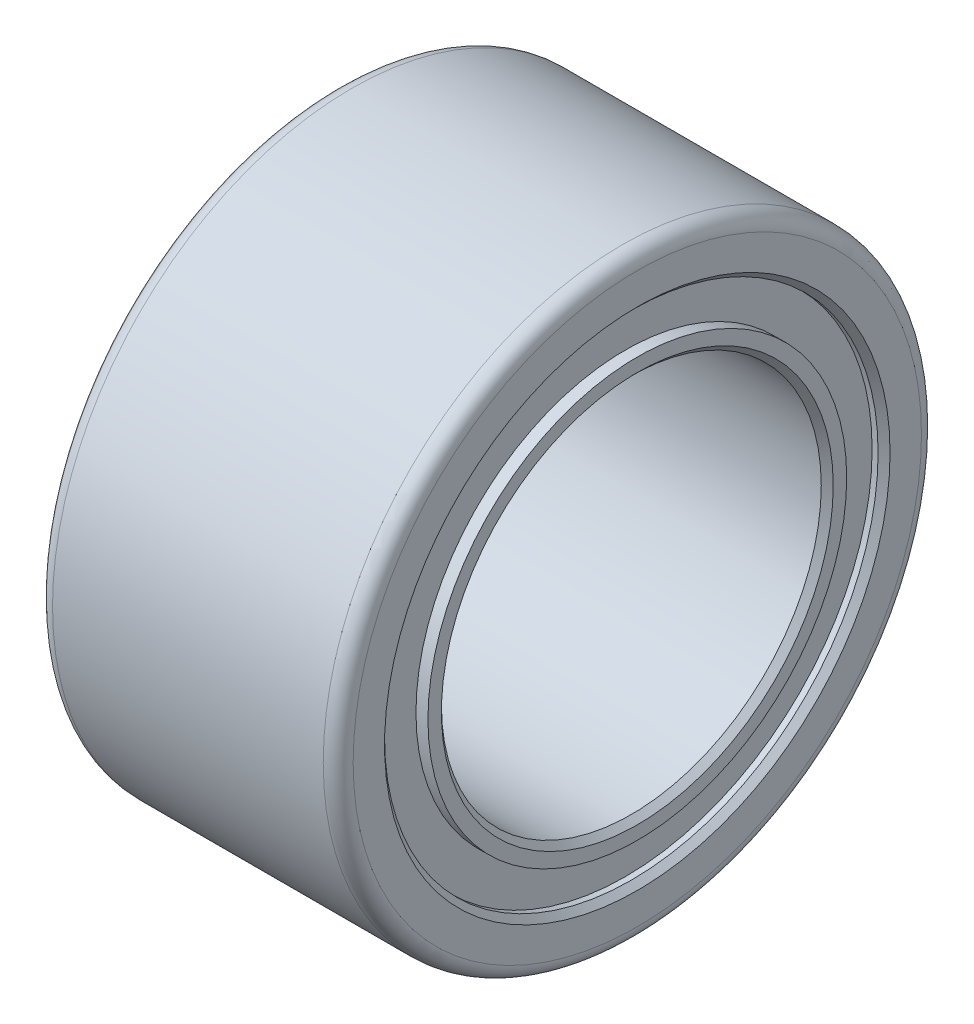
ISO-10303-21;
HEADER;
FILE_DESCRIPTION(('STEP AP214'),'2;1');
FILE_NAME('part.step','',(''),(''),'','','');
FILE_SCHEMA(('AUTOMOTIVE_DESIGN { 1 0 10303 214 1 1 1 1 }'));
ENDSEC;
DATA;
#1=APPLICATION_CONTEXT('core data for automotive mechanical design processes');
#2=APPLICATION_PROTOCOL_DEFINITION('international standard','automotive_design',2000,#1);
#3=PRODUCT_CONTEXT('',#1,'mechanical');
#4=PRODUCT('Part','Part','',(#3));
#5=PRODUCT_RELATED_PRODUCT_CATEGORY('part','',(#4));
#6=PRODUCT_DEFINITION_FORMATION('','',#4);
#7=PRODUCT_DEFINITION_CONTEXT('part definition',#1,'design');
#8=PRODUCT_DEFINITION('design','',#6,#7);
#9=PRODUCT_DEFINITION_SHAPE('','',#8);
#10=(LENGTH_UNIT() NAMED_UNIT(*) SI_UNIT(.MILLI.,.METRE.));
#11=(NAMED_UNIT(*) PLANE_ANGLE_UNIT() SI_UNIT($,.RADIAN.));
#12=(NAMED_UNIT(*) SI_UNIT($,.STERADIAN.) SOLID_ANGLE_UNIT());
#13=UNCERTAINTY_MEASURE_WITH_UNIT(LENGTH_MEASURE(1.E-05),#10,'distance_accuracy_value','');
#14=(GEOMETRIC_REPRESENTATION_CONTEXT(3) GLOBAL_UNCERTAINTY_ASSIGNED_CONTEXT((#13)) GLOBAL_UNIT_ASSIGNED_CONTEXT((#10,
#11,#12)) REPRESENTATION_CONTEXT('',''));
#15=CARTESIAN_POINT('',(0.,0.,0.));
#16=DIRECTION('',(0.,0.,1.));
#17=DIRECTION('',(1.,0.,0.));
#18=AXIS2_PLACEMENT_3D('',#15,#16,#17);
#19=CARTESIAN_POINT('',(-2.4892,0.,0.));
#20=DIRECTION('',(1.,0.,0.));
#21=DIRECTION('',(0.,0.,-1.));
#22=AXIS2_PLACEMENT_3D('',#19,#20,#21);
#23=PLANE('',#22);
#24=CARTESIAN_POINT('',(-2.4892,0.,0.));
#25=DIRECTION('',(1.,0.,0.));
#26=DIRECTION('',(0.,0.,-1.));
#27=AXIS2_PLACEMENT_3D('',#24,#25,#26);
#28=CIRCLE('',#27,4.9);
#29=CARTESIAN_POINT('',(-2.4892,0.,-4.9));
#30=VERTEX_POINT('',#29);
#31=EDGE_CURVE('E52',#30,#30,#28,.F.);
#32=ORIENTED_EDGE('',*,*,#31,.T.);
#33=EDGE_LOOP('',(#32));
#34=FACE_BOUND('',#33,.T.);
#35=CARTESIAN_POINT('',(-2.4892,0.,0.));
#36=DIRECTION('',(1.,0.,0.));
#37=DIRECTION('',(0.,0.,-1.));
#38=AXIS2_PLACEMENT_3D('',#35,#36,#37);
#39=CIRCLE('',#38,4.125);
#40=CARTESIAN_POINT('',(-2.4892,0.,-4.125));
#41=VERTEX_POINT('',#40);
#42=EDGE_CURVE('E83',#41,#41,#39,.T.);
#43=ORIENTED_EDGE('',*,*,#42,.T.);
#44=EDGE_LOOP('',(#43));
#45=FACE_BOUND('',#44,.T.);
#46=ADVANCED_FACE('F32',(#34,#45),#23,.F.);
#47=CARTESIAN_POINT('',(2.4892,0.,0.));
#48=DIRECTION('',(1.,0.,0.));
#49=DIRECTION('',(0.,0.,-1.));
#50=AXIS2_PLACEMENT_3D('',#47,#48,#49);
#51=PLANE('',#50);
#52=CARTESIAN_POINT('',(2.4892,0.,0.));
#53=DIRECTION('',(1.,0.,0.));
#54=DIRECTION('',(0.,0.,-1.));
#55=AXIS2_PLACEMENT_3D('',#52,#53,#54);
#56=CIRCLE('',#55,3.275);
#57=CARTESIAN_POINT('',(2.4892,0.,-3.275));
#58=VERTEX_POINT('',#57);
#59=EDGE_CURVE('E58',#58,#58,#56,.F.);
#60=ORIENTED_EDGE('',*,*,#59,.T.);
#61=EDGE_LOOP('',(#60));
#62=FACE_BOUND('',#61,.T.);
#63=CARTESIAN_POINT('',(2.4892,0.,0.));
#64=DIRECTION('',(1.,0.,0.));
#65=DIRECTION('',(0.,0.,-1.));
#66=AXIS2_PLACEMENT_3D('',#63,#64,#65);
#67=CIRCLE('',#66,3.5);
#68=CARTESIAN_POINT('',(2.4892,0.,-3.5));
#69=VERTEX_POINT('',#68);
#70=EDGE_CURVE('E77',#69,#69,#67,.T.);
#71=ORIENTED_EDGE('',*,*,#70,.T.);
#72=EDGE_LOOP('',(#71));
#73=FACE_BOUND('',#72,.T.);
#74=ADVANCED_FACE('F120',(#62,#73),#51,.T.);
#75=CARTESIAN_POINT('',(2.4892,0.,0.));
#76=DIRECTION('',(-1.,0.,0.));
#77=DIRECTION('',(0.,0.,1.));
#78=AXIS2_PLACEMENT_3D('',#75,#76,#77);
#79=CYLINDRICAL_SURFACE('',#78,5.);
#80=CARTESIAN_POINT('',(-2.28564660940672,0.,0.));
#81=DIRECTION('',(-1.,0.,0.));
#82=DIRECTION('',(0.,0.,1.));
#83=AXIS2_PLACEMENT_3D('',#80,#81,#82);
#84=CIRCLE('',#83,5.);
#85=CARTESIAN_POINT('',(-2.28564660940672,0.,5.));
#86=VERTEX_POINT('',#85);
#87=EDGE_CURVE('E43',#86,#86,#84,.F.);
#88=ORIENTED_EDGE('',*,*,#87,.T.);
#89=EDGE_LOOP('',(#88));
#90=FACE_BOUND('',#89,.T.);
#91=CARTESIAN_POINT('',(2.2392,0.,0.));
#92=DIRECTION('',(1.,0.,0.));
#93=DIRECTION('',(0.,0.,-1.));
#94=AXIS2_PLACEMENT_3D('',#91,#92,#93);
#95=CIRCLE('',#94,5.);
#96=CARTESIAN_POINT('',(2.2392,0.,-5.));
#97=VERTEX_POINT('',#96);
#98=EDGE_CURVE('E47',#97,#97,#95,.F.);
#99=ORIENTED_EDGE('',*,*,#98,.T.);
#100=EDGE_LOOP('',(#99));
#101=FACE_BOUND('',#100,.T.);
#102=ADVANCED_FACE('F118',(#90,#101),#79,.T.);
#103=CARTESIAN_POINT('',(2.4892,0.,0.));
#104=DIRECTION('',(1.,0.,0.));
#105=DIRECTION('',(0.,0.,-1.));
#106=AXIS2_PLACEMENT_3D('',#103,#104,#105);
#107=CIRCLE('',#106,4.75);
#108=CARTESIAN_POINT('',(2.4892,0.,-4.75));
#109=VERTEX_POINT('',#108);
#110=EDGE_CURVE('E10',#109,#109,#107,.T.);
#111=ORIENTED_EDGE('',*,*,#110,.T.);
#112=EDGE_LOOP('',(#111));
#113=FACE_BOUND('',#112,.T.);
#114=CARTESIAN_POINT('',(2.4892,0.,0.));
#115=DIRECTION('',(1.,0.,0.));
#116=DIRECTION('',(0.,0.,-1.));
#117=AXIS2_PLACEMENT_3D('',#114,#115,#116);
#118=CIRCLE('',#117,4.225);
#119=CARTESIAN_POINT('',(2.4892,0.,-4.225));
#120=VERTEX_POINT('',#119);
#121=EDGE_CURVE('E67',#120,#120,#118,.F.);
#122=ORIENTED_EDGE('',*,*,#121,.T.);
#123=EDGE_LOOP('',(#122));
#124=FACE_BOUND('',#123,.T.);
#125=ADVANCED_FACE('F108',(#113,#124),#51,.T.);
#126=CARTESIAN_POINT('',(-2.4892,0.,0.));
#127=DIRECTION('',(1.,0.,0.));
#128=DIRECTION('',(0.,0.,-1.));
#129=AXIS2_PLACEMENT_3D('',#126,#127,#128);
#130=CIRCLE('',#129,3.275);
#131=CARTESIAN_POINT('',(-2.4892,0.,-3.275));
#132=VERTEX_POINT('',#131);
#133=EDGE_CURVE('E55',#132,#132,#130,.T.);
#134=ORIENTED_EDGE('',*,*,#133,.T.);
#135=EDGE_LOOP('',(#134));
#136=FACE_BOUND('',#135,.T.);
#137=CARTESIAN_POINT('',(-2.4892,0.,0.));
#138=DIRECTION('',(1.,0.,0.));
#139=DIRECTION('',(0.,0.,-1.));
#140=AXIS2_PLACEMENT_3D('',#137,#138,#139);
#141=CIRCLE('',#140,3.5);
#142=CARTESIAN_POINT('',(-2.4892,0.,-3.5));
#143=VERTEX_POINT('',#142);
#144=EDGE_CURVE('E89',#143,#143,#141,.T.);
#145=ORIENTED_EDGE('',*,*,#144,.F.);
#146=EDGE_LOOP('',(#145));
#147=FACE_BOUND('',#146,.T.);
#148=ADVANCED_FACE('F105',(#136,#147),#23,.F.);
#149=CARTESIAN_POINT('',(-2.4892,0.,0.));
#150=DIRECTION('',(1.,0.,0.));
#151=DIRECTION('',(0.,0.,-1.));
#152=AXIS2_PLACEMENT_3D('',#149,#150,#151);
#153=CYLINDRICAL_SURFACE('',#152,3.175);
#154=CARTESIAN_POINT('',(2.3892,0.,0.));
#155=DIRECTION('',(1.,0.,0.));
#156=DIRECTION('',(0.,0.,-1.));
#157=AXIS2_PLACEMENT_3D('',#154,#155,#156);
#158=CIRCLE('',#157,3.175);
#159=CARTESIAN_POINT('',(2.3892,0.,-3.175));
#160=VERTEX_POINT('',#159);
#161=EDGE_CURVE('E61',#160,#160,#158,.T.);
#162=ORIENTED_EDGE('',*,*,#161,.T.);
#163=EDGE_LOOP('',(#162));
#164=FACE_BOUND('',#163,.T.);
#165=CARTESIAN_POINT('',(-2.3892,0.,0.));
#166=DIRECTION('',(1.,0.,0.));
#167=DIRECTION('',(0.,0.,-1.));
#168=AXIS2_PLACEMENT_3D('',#165,#166,#167);
#169=CIRCLE('',#168,3.175);
#170=CARTESIAN_POINT('',(-2.3892,0.,-3.175));
#171=VERTEX_POINT('',#170);
#172=EDGE_CURVE('E64',#171,#171,#169,.F.);
#173=ORIENTED_EDGE('',*,*,#172,.T.);
#174=EDGE_LOOP('',(#173));
#175=FACE_BOUND('',#174,.T.);
#176=ADVANCED_FACE('F107',(#164,#175),#153,.F.);
#177=CARTESIAN_POINT('',(2.2892,0.,0.));
#178=DIRECTION('',(1.,0.,0.));
#179=DIRECTION('',(0.,0.,-1.));
#180=AXIS2_PLACEMENT_3D('',#177,#178,#179);
#181=CYLINDRICAL_SURFACE('',#180,4.125);
#182=CARTESIAN_POINT('',(2.3892,0.,0.));
#183=DIRECTION('',(1.,0.,0.));
#184=DIRECTION('',(0.,0.,-1.));
#185=AXIS2_PLACEMENT_3D('',#182,#183,#184);
#186=CIRCLE('',#185,4.125);
#187=CARTESIAN_POINT('',(2.3892,0.,-4.125));
#188=VERTEX_POINT('',#187);
#189=EDGE_CURVE('E70',#188,#188,#186,.T.);
#190=ORIENTED_EDGE('',*,*,#189,.T.);
#191=EDGE_LOOP('',(#190));
#192=FACE_BOUND('',#191,.T.);
#193=CARTESIAN_POINT('',(2.2892,0.,0.));
#194=DIRECTION('',(1.,0.,0.));
#195=DIRECTION('',(0.,0.,-1.));
#196=AXIS2_PLACEMENT_3D('',#193,#194,#195);
#197=CIRCLE('',#196,4.125);
#198=CARTESIAN_POINT('',(2.2892,0.,-4.125));
#199=VERTEX_POINT('',#198);
#200=EDGE_CURVE('E73',#199,#199,#197,.T.);
#201=ORIENTED_EDGE('',*,*,#200,.F.);
#202=EDGE_LOOP('',(#201));
#203=FACE_BOUND('',#202,.T.);
#204=ADVANCED_FACE('F115',(#192,#203),#181,.F.);
#205=CARTESIAN_POINT('',(2.2892,0.,0.));
#206=DIRECTION('',(1.,0.,0.));
#207=DIRECTION('',(0.,0.,-1.));
#208=AXIS2_PLACEMENT_3D('',#205,#206,#207);
#209=PLANE('',#208);
#210=CARTESIAN_POINT('',(2.2892,0.,0.));
#211=DIRECTION('',(1.,0.,0.));
#212=DIRECTION('',(0.,0.,-1.));
#213=AXIS2_PLACEMENT_3D('',#210,#211,#212);
#214=CIRCLE('',#213,3.5);
#215=CARTESIAN_POINT('',(2.2892,0.,-3.5));
#216=VERTEX_POINT('',#215);
#217=EDGE_CURVE('E76',#216,#216,#214,.T.);
#218=ORIENTED_EDGE('',*,*,#217,.F.);
#219=EDGE_LOOP('',(#218));
#220=FACE_BOUND('',#219,.T.);
#221=ORIENTED_EDGE('',*,*,#200,.T.);
#222=EDGE_LOOP('',(#221));
#223=FACE_BOUND('',#222,.T.);
#224=ADVANCED_FACE('F144',(#220,#223),#209,.T.);
#225=CARTESIAN_POINT('',(2.2892,0.,0.));
#226=DIRECTION('',(1.,0.,0.));
#227=DIRECTION('',(0.,0.,-1.));
#228=AXIS2_PLACEMENT_3D('',#225,#226,#227);
#229=CYLINDRICAL_SURFACE('',#228,3.5);
#230=ORIENTED_EDGE('',*,*,#217,.T.);
#231=EDGE_LOOP('',(#230));
#232=FACE_BOUND('',#231,.T.);
#233=ORIENTED_EDGE('',*,*,#70,.F.);
#234=EDGE_LOOP('',(#233));
#235=FACE_BOUND('',#234,.T.);
#236=ADVANCED_FACE('F138',(#232,#235),#229,.T.);
#237=CARTESIAN_POINT('',(-2.2892,0.,0.));
#238=DIRECTION('',(-1.,0.,0.));
#239=DIRECTION('',(0.,0.,-1.));
#240=AXIS2_PLACEMENT_3D('',#237,#238,#239);
#241=PLANE('',#240);
#242=CARTESIAN_POINT('',(-2.2892,0.,0.));
#243=DIRECTION('',(1.,0.,0.));
#244=DIRECTION('',(0.,0.,-1.));
#245=AXIS2_PLACEMENT_3D('',#242,#243,#244);
#246=CIRCLE('',#245,4.125);
#247=CARTESIAN_POINT('',(-2.2892,0.,-4.125));
#248=VERTEX_POINT('',#247);
#249=EDGE_CURVE('E80',#248,#248,#246,.T.);
#250=ORIENTED_EDGE('',*,*,#249,.F.);
#251=EDGE_LOOP('',(#250));
#252=FACE_BOUND('',#251,.T.);
#253=CARTESIAN_POINT('',(-2.2892,0.,0.));
#254=DIRECTION('',(1.,0.,0.));
#255=DIRECTION('',(0.,0.,-1.));
#256=AXIS2_PLACEMENT_3D('',#253,#254,#255);
#257=CIRCLE('',#256,3.5);
#258=CARTESIAN_POINT('',(-2.2892,0.,-3.5));
#259=VERTEX_POINT('',#258);
#260=EDGE_CURVE('E86',#259,#259,#257,.T.);
#261=ORIENTED_EDGE('',*,*,#260,.T.);
#262=EDGE_LOOP('',(#261));
#263=FACE_BOUND('',#262,.T.);
#264=ADVANCED_FACE('F95',(#252,#263),#241,.T.);
#265=CARTESIAN_POINT('',(-2.2892,0.,0.));
#266=DIRECTION('',(-1.,0.,0.));
#267=DIRECTION('',(0.,0.,1.));
#268=AXIS2_PLACEMENT_3D('',#265,#266,#267);
#269=CYLINDRICAL_SURFACE('',#268,4.125);
#270=ORIENTED_EDGE('',*,*,#249,.T.);
#271=EDGE_LOOP('',(#270));
#272=FACE_BOUND('',#271,.T.);
#273=ORIENTED_EDGE('',*,*,#42,.F.);
#274=EDGE_LOOP('',(#273));
#275=FACE_BOUND('',#274,.T.);
#276=ADVANCED_FACE('F101',(#272,#275),#269,.F.);
#277=CARTESIAN_POINT('',(-2.2892,0.,0.));
#278=DIRECTION('',(-1.,0.,0.));
#279=DIRECTION('',(0.,0.,1.));
#280=AXIS2_PLACEMENT_3D('',#277,#278,#279);
#281=CYLINDRICAL_SURFACE('',#280,3.5);
#282=ORIENTED_EDGE('',*,*,#260,.F.);
#283=EDGE_LOOP('',(#282));
#284=FACE_BOUND('',#283,.T.);
#285=ORIENTED_EDGE('',*,*,#144,.T.);
#286=EDGE_LOOP('',(#285));
#287=FACE_BOUND('',#286,.T.);
#288=ADVANCED_FACE('F97',(#284,#287),#281,.T.);
#289=CARTESIAN_POINT('',(2.3892,0.,0.));
#290=DIRECTION('',(1.,0.,0.));
#291=DIRECTION('',(0.,0.,-1.));
#292=AXIS2_PLACEMENT_3D('',#289,#290,#291);
#293=CONICAL_SURFACE('',#292,4.125,0.785398163397461);
#294=ORIENTED_EDGE('',*,*,#121,.F.);
#295=EDGE_LOOP('',(#294));
#296=FACE_BOUND('',#295,.T.);
#297=ORIENTED_EDGE('',*,*,#189,.F.);
#298=EDGE_LOOP('',(#297));
#299=FACE_BOUND('',#298,.T.);
#300=ADVANCED_FACE('F100',(#296,#299),#293,.F.);
#301=CARTESIAN_POINT('',(2.3892,0.,0.));
#302=DIRECTION('',(1.,0.,0.));
#303=DIRECTION('',(0.,0.,-1.));
#304=AXIS2_PLACEMENT_3D('',#301,#302,#303);
#305=CONICAL_SURFACE('',#304,3.175,0.78539816339745);
#306=ORIENTED_EDGE('',*,*,#59,.F.);
#307=EDGE_LOOP('',(#306));
#308=FACE_BOUND('',#307,.T.);
#309=ORIENTED_EDGE('',*,*,#161,.F.);
#310=EDGE_LOOP('',(#309));
#311=FACE_BOUND('',#310,.T.);
#312=ADVANCED_FACE('F159',(#308,#311),#305,.F.);
#313=CARTESIAN_POINT('',(-2.4892,0.,0.));
#314=DIRECTION('',(-1.,0.,0.));
#315=DIRECTION('',(0.,0.,1.));
#316=AXIS2_PLACEMENT_3D('',#313,#314,#315);
#317=CONICAL_SURFACE('',#316,3.275,0.785398163397442);
#318=ORIENTED_EDGE('',*,*,#172,.F.);
#319=EDGE_LOOP('',(#318));
#320=FACE_BOUND('',#319,.T.);
#321=ORIENTED_EDGE('',*,*,#133,.F.);
#322=EDGE_LOOP('',(#321));
#323=FACE_BOUND('',#322,.T.);
#324=ADVANCED_FACE('F165',(#320,#323),#317,.F.);
#325=CARTESIAN_POINT('',(-2.3892,0.,0.));
#326=DIRECTION('',(1.,0.,0.));
#327=DIRECTION('',(0.,0.,-1.));
#328=AXIS2_PLACEMENT_3D('',#325,#326,#327);
#329=CONICAL_SURFACE('',#328,5.,0.785398163397457);
#330=CARTESIAN_POINT('',(-2.46242330470336,0.,0.));
#331=DIRECTION('',(1.,0.,0.));
#332=DIRECTION('',(0.,0.,-1.));
#333=AXIS2_PLACEMENT_3D('',#330,#331,#332);
#334=CIRCLE('',#333,4.92677669529664);
#335=CARTESIAN_POINT('',(-2.46242330470336,0.,-4.92677669529664));
#336=VERTEX_POINT('',#335);
#337=EDGE_CURVE('E39',#336,#336,#334,.F.);
#338=ORIENTED_EDGE('',*,*,#337,.T.);
#339=EDGE_LOOP('',(#338));
#340=FACE_BOUND('',#339,.T.);
#341=ORIENTED_EDGE('',*,*,#31,.F.);
#342=EDGE_LOOP('',(#341));
#343=FACE_BOUND('',#342,.T.);
#344=ADVANCED_FACE('F172',(#340,#343),#329,.T.);
#345=CARTESIAN_POINT('',(-2.28564660940672,0.,0.));
#346=DIRECTION('',(-1.,0.,0.));
#347=DIRECTION('',(0.,0.,1.));
#348=AXIS2_PLACEMENT_3D('',#345,#346,#347);
#349=TOROIDAL_SURFACE('',#348,4.75,0.25);
#350=ORIENTED_EDGE('',*,*,#337,.F.);
#351=EDGE_LOOP('',(#350));
#352=FACE_BOUND('',#351,.T.);
#353=ORIENTED_EDGE('',*,*,#87,.F.);
#354=EDGE_LOOP('',(#353));
#355=FACE_BOUND('',#354,.T.);
#356=ADVANCED_FACE('F175',(#352,#355),#349,.T.);
#357=CARTESIAN_POINT('',(2.2392,0.,0.));
#358=DIRECTION('',(1.,0.,0.));
#359=DIRECTION('',(0.,0.,-1.));
#360=AXIS2_PLACEMENT_3D('',#357,#358,#359);
#361=TOROIDAL_SURFACE('',#360,4.75,0.25);
#362=ORIENTED_EDGE('',*,*,#98,.F.);
#363=EDGE_LOOP('',(#362));
#364=FACE_BOUND('',#363,.T.);
#365=ORIENTED_EDGE('',*,*,#110,.F.);
#366=EDGE_LOOP('',(#365));
#367=FACE_BOUND('',#366,.T.);
#368=ADVANCED_FACE('F34',(#364,#367),#361,.T.);
#369=CLOSED_SHELL('',(#46,#74,#102,#125,#148,#176,#204,#224,#236,#264,#276,#288,#300,#312,#324,
#344,#356,#368));
#370=MANIFOLD_SOLID_BREP('B2',#369);
#371=ADVANCED_BREP_SHAPE_REPRESENTATION('',(#18,#370),#14);
#372=SHAPE_DEFINITION_REPRESENTATION(#9,#371);
ENDSEC;
END-ISO-10303-21;
